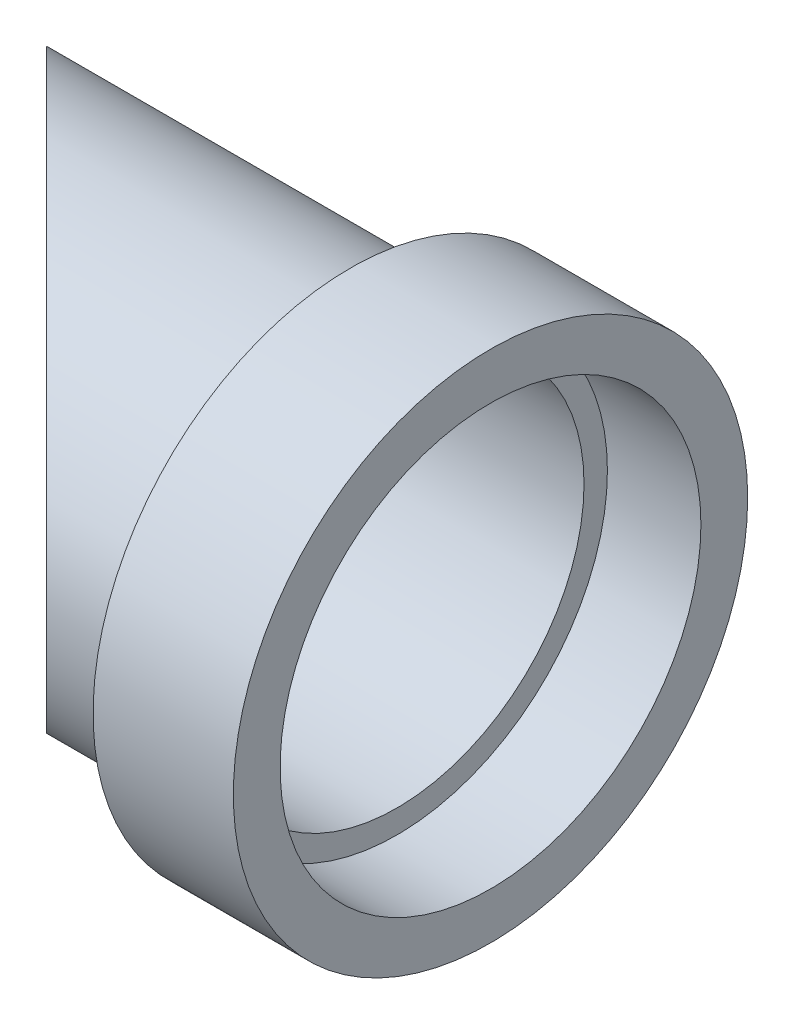
ISO-10303-21;
HEADER;
FILE_DESCRIPTION(('STEP AP214'),'2;1');
FILE_NAME('part.step','',(''),(''),'','','');
FILE_SCHEMA(('AUTOMOTIVE_DESIGN { 1 0 10303 214 1 1 1 1 }'));
ENDSEC;
DATA;
#1=APPLICATION_CONTEXT('core data for automotive mechanical design processes');
#2=APPLICATION_PROTOCOL_DEFINITION('international standard','automotive_design',2000,#1);
#3=PRODUCT_CONTEXT('',#1,'mechanical');
#4=PRODUCT('Part','Part','',(#3));
#5=PRODUCT_RELATED_PRODUCT_CATEGORY('part','',(#4));
#6=PRODUCT_DEFINITION_FORMATION('','',#4);
#7=PRODUCT_DEFINITION_CONTEXT('part definition',#1,'design');
#8=PRODUCT_DEFINITION('design','',#6,#7);
#9=PRODUCT_DEFINITION_SHAPE('','',#8);
#10=(LENGTH_UNIT() NAMED_UNIT(*) SI_UNIT(.MILLI.,.METRE.));
#11=(NAMED_UNIT(*) PLANE_ANGLE_UNIT() SI_UNIT($,.RADIAN.));
#12=(NAMED_UNIT(*) SI_UNIT($,.STERADIAN.) SOLID_ANGLE_UNIT());
#13=UNCERTAINTY_MEASURE_WITH_UNIT(LENGTH_MEASURE(1.E-05),#10,'distance_accuracy_value','');
#14=(GEOMETRIC_REPRESENTATION_CONTEXT(3) GLOBAL_UNCERTAINTY_ASSIGNED_CONTEXT((#13)) GLOBAL_UNIT_ASSIGNED_CONTEXT((#10,
#11,#12)) REPRESENTATION_CONTEXT('',''));
#15=CARTESIAN_POINT('',(0.,0.,0.));
#16=DIRECTION('',(0.,0.,1.));
#17=DIRECTION('',(1.,0.,0.));
#18=AXIS2_PLACEMENT_3D('',#15,#16,#17);
#19=CARTESIAN_POINT('',(152.4,0.,0.));
#20=DIRECTION('',(-1.,0.,0.));
#21=DIRECTION('',(0.,0.,1.));
#22=AXIS2_PLACEMENT_3D('',#19,#20,#21);
#23=CYLINDRICAL_SURFACE('',#22,57.15);
#24=CARTESIAN_POINT('',(139.7,0.,0.));
#25=DIRECTION('',(1.,0.,0.));
#26=DIRECTION('',(0.,0.,-1.));
#27=AXIS2_PLACEMENT_3D('',#24,#25,#26);
#28=CIRCLE('',#27,57.15);
#29=CARTESIAN_POINT('',(139.7,0.,-57.15));
#30=VERTEX_POINT('',#29);
#31=EDGE_CURVE('E10',#30,#30,#28,.T.);
#32=ORIENTED_EDGE('',*,*,#31,.F.);
#33=EDGE_LOOP('',(#32));
#34=FACE_BOUND('',#33,.T.);
#35=CARTESIAN_POINT('',(57.1500000000001,0.,0.));
#36=DIRECTION('',(-0.707106781186548,0.,0.707106781186547));
#37=DIRECTION('',(-0.707106781186547,0.,-0.707106781186548));
#38=AXIS2_PLACEMENT_3D('',#35,#36,#37);
#39=ELLIPSE('',#38,80.8223050896224,57.15);
#40=CARTESIAN_POINT('',(0.,0.,-57.15));
#41=VERTEX_POINT('',#40);
#42=EDGE_CURVE('E60',#41,#41,#39,.T.);
#43=ORIENTED_EDGE('',*,*,#42,.F.);
#44=EDGE_LOOP('',(#43));
#45=FACE_BOUND('',#44,.T.);
#46=ADVANCED_FACE('F35',(#34,#45),#23,.T.);
#47=CARTESIAN_POINT('',(152.4,0.,0.));
#48=DIRECTION('',(-1.,0.,0.));
#49=DIRECTION('',(0.,0.,1.));
#50=AXIS2_PLACEMENT_3D('',#47,#48,#49);
#51=CYLINDRICAL_SURFACE('',#50,50.8);
#52=CARTESIAN_POINT('',(152.4,0.,0.));
#53=DIRECTION('',(1.,0.,0.));
#54=DIRECTION('',(0.,0.,-1.));
#55=AXIS2_PLACEMENT_3D('',#52,#53,#54);
#56=CIRCLE('',#55,50.8);
#57=CARTESIAN_POINT('',(152.4,0.,-50.8));
#58=VERTEX_POINT('',#57);
#59=EDGE_CURVE('E42',#58,#58,#56,.T.);
#60=ORIENTED_EDGE('',*,*,#59,.T.);
#61=EDGE_LOOP('',(#60));
#62=FACE_BOUND('',#61,.T.);
#63=CARTESIAN_POINT('',(57.1500000000001,0.,0.));
#64=DIRECTION('',(-0.707106781186548,0.,0.707106781186547));
#65=DIRECTION('',(-0.707106781186547,0.,-0.707106781186548));
#66=AXIS2_PLACEMENT_3D('',#63,#64,#65);
#67=ELLIPSE('',#66,71.8420489685532,50.8);
#68=CARTESIAN_POINT('',(6.35000000000011,0.,-50.8));
#69=VERTEX_POINT('',#68);
#70=EDGE_CURVE('E38',#69,#69,#67,.T.);
#71=ORIENTED_EDGE('',*,*,#70,.T.);
#72=EDGE_LOOP('',(#71));
#73=FACE_BOUND('',#72,.T.);
#74=ADVANCED_FACE('F67',(#62,#73),#51,.F.);
#75=CARTESIAN_POINT('',(152.4,0.,0.));
#76=DIRECTION('',(1.,0.,0.));
#77=DIRECTION('',(0.,0.,-1.));
#78=AXIS2_PLACEMENT_3D('',#75,#76,#77);
#79=PLANE('',#78);
#80=CARTESIAN_POINT('',(152.4,0.,0.));
#81=DIRECTION('',(1.,0.,0.));
#82=DIRECTION('',(0.,0.,-1.));
#83=AXIS2_PLACEMENT_3D('',#80,#81,#82);
#84=CIRCLE('',#83,57.15);
#85=CARTESIAN_POINT('',(152.4,0.,-57.15));
#86=VERTEX_POINT('',#85);
#87=EDGE_CURVE('E46',#86,#86,#84,.T.);
#88=ORIENTED_EDGE('',*,*,#87,.T.);
#89=EDGE_LOOP('',(#88));
#90=FACE_BOUND('',#89,.T.);
#91=ORIENTED_EDGE('',*,*,#59,.F.);
#92=EDGE_LOOP('',(#91));
#93=FACE_BOUND('',#92,.T.);
#94=ADVANCED_FACE('F84',(#90,#93),#79,.T.);
#95=CARTESIAN_POINT('',(139.7,0.,0.));
#96=DIRECTION('',(1.,0.,0.));
#97=DIRECTION('',(0.,0.,-1.));
#98=AXIS2_PLACEMENT_3D('',#95,#96,#97);
#99=CYLINDRICAL_SURFACE('',#98,69.85);
#100=CARTESIAN_POINT('',(139.7,0.,0.));
#101=DIRECTION('',(1.,0.,0.));
#102=DIRECTION('',(0.,0.,-1.));
#103=AXIS2_PLACEMENT_3D('',#100,#101,#102);
#104=CIRCLE('',#103,69.85);
#105=CARTESIAN_POINT('',(139.7,0.,-69.85));
#106=VERTEX_POINT('',#105);
#107=EDGE_CURVE('E51',#106,#106,#104,.T.);
#108=ORIENTED_EDGE('',*,*,#107,.T.);
#109=EDGE_LOOP('',(#108));
#110=FACE_BOUND('',#109,.T.);
#111=CARTESIAN_POINT('',(177.8,0.,0.));
#112=DIRECTION('',(1.,0.,0.));
#113=DIRECTION('',(0.,0.,-1.));
#114=AXIS2_PLACEMENT_3D('',#111,#112,#113);
#115=CIRCLE('',#114,69.85);
#116=CARTESIAN_POINT('',(177.8,0.,-69.85));
#117=VERTEX_POINT('',#116);
#118=EDGE_CURVE('E54',#117,#117,#115,.T.);
#119=ORIENTED_EDGE('',*,*,#118,.F.);
#120=EDGE_LOOP('',(#119));
#121=FACE_BOUND('',#120,.T.);
#122=ADVANCED_FACE('F91',(#110,#121),#99,.T.);
#123=CARTESIAN_POINT('',(139.7,0.,0.));
#124=DIRECTION('',(1.,0.,0.));
#125=DIRECTION('',(0.,0.,-1.));
#126=AXIS2_PLACEMENT_3D('',#123,#124,#125);
#127=PLANE('',#126);
#128=ORIENTED_EDGE('',*,*,#31,.T.);
#129=EDGE_LOOP('',(#128));
#130=FACE_BOUND('',#129,.T.);
#131=ORIENTED_EDGE('',*,*,#107,.F.);
#132=EDGE_LOOP('',(#131));
#133=FACE_BOUND('',#132,.T.);
#134=ADVANCED_FACE('F96',(#130,#133),#127,.F.);
#135=CARTESIAN_POINT('',(139.7,0.,0.));
#136=DIRECTION('',(1.,0.,0.));
#137=DIRECTION('',(0.,0.,-1.));
#138=AXIS2_PLACEMENT_3D('',#135,#136,#137);
#139=CYLINDRICAL_SURFACE('',#138,57.15);
#140=ORIENTED_EDGE('',*,*,#87,.F.);
#141=EDGE_LOOP('',(#140));
#142=FACE_BOUND('',#141,.T.);
#143=CARTESIAN_POINT('',(177.8,0.,0.));
#144=DIRECTION('',(1.,0.,0.));
#145=DIRECTION('',(0.,0.,-1.));
#146=AXIS2_PLACEMENT_3D('',#143,#144,#145);
#147=CIRCLE('',#146,57.15);
#148=CARTESIAN_POINT('',(177.8,0.,-57.15));
#149=VERTEX_POINT('',#148);
#150=EDGE_CURVE('E57',#149,#149,#147,.T.);
#151=ORIENTED_EDGE('',*,*,#150,.T.);
#152=EDGE_LOOP('',(#151));
#153=FACE_BOUND('',#152,.T.);
#154=ADVANCED_FACE('F76',(#142,#153),#139,.F.);
#155=CARTESIAN_POINT('',(177.8,0.,0.));
#156=DIRECTION('',(1.,0.,0.));
#157=DIRECTION('',(0.,0.,-1.));
#158=AXIS2_PLACEMENT_3D('',#155,#156,#157);
#159=PLANE('',#158);
#160=ORIENTED_EDGE('',*,*,#118,.T.);
#161=EDGE_LOOP('',(#160));
#162=FACE_BOUND('',#161,.T.);
#163=ORIENTED_EDGE('',*,*,#150,.F.);
#164=EDGE_LOOP('',(#163));
#165=FACE_BOUND('',#164,.T.);
#166=ADVANCED_FACE('F71',(#162,#165),#159,.T.);
#167=CARTESIAN_POINT('',(114.3,127.,57.15));
#168=DIRECTION('',(-0.707106781186548,0.,0.707106781186547));
#169=DIRECTION('',(0.707106781186547,0.,0.707106781186548));
#170=AXIS2_PLACEMENT_3D('',#167,#168,#169);
#171=PLANE('',#170);
#172=ORIENTED_EDGE('',*,*,#70,.F.);
#173=EDGE_LOOP('',(#172));
#174=FACE_BOUND('',#173,.T.);
#175=ORIENTED_EDGE('',*,*,#42,.T.);
#176=EDGE_LOOP('',(#175));
#177=FACE_BOUND('',#176,.T.);
#178=ADVANCED_FACE('F69',(#174,#177),#171,.T.);
#179=CLOSED_SHELL('',(#46,#74,#94,#122,#134,#154,#166,#178));
#180=MANIFOLD_SOLID_BREP('B2',#179);
#181=ADVANCED_BREP_SHAPE_REPRESENTATION('',(#18,#180),#14);
#182=SHAPE_DEFINITION_REPRESENTATION(#9,#181);
ENDSEC;
END-ISO-10303-21;
